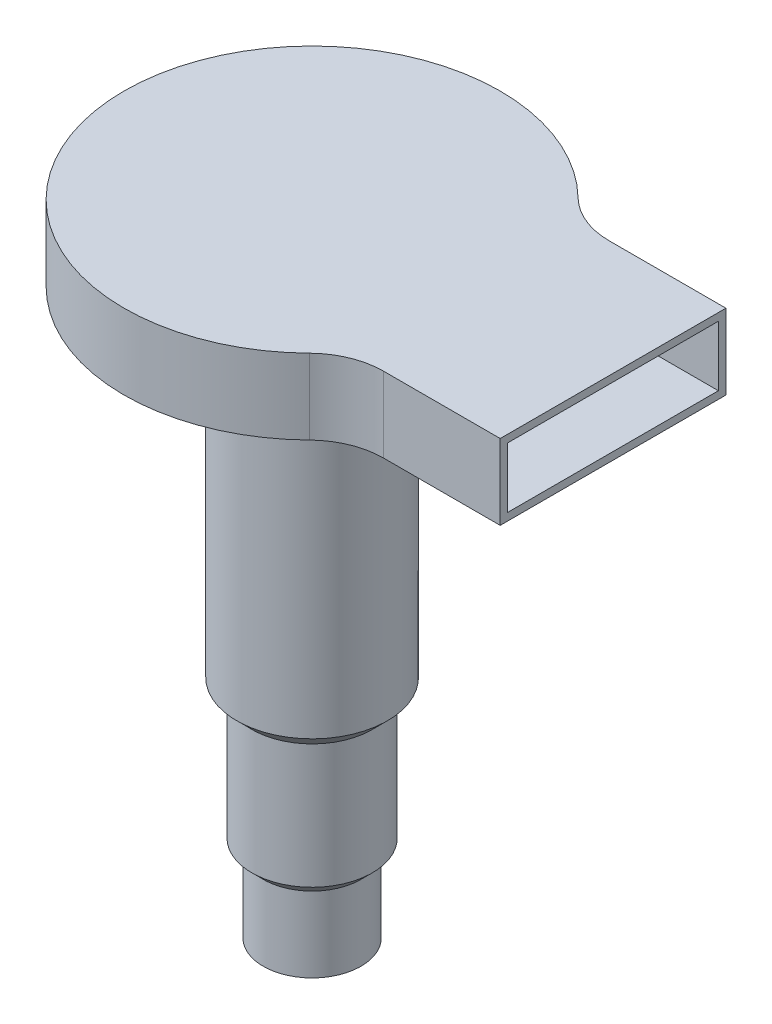
ISO-10303-21;
HEADER;
FILE_DESCRIPTION(('STEP AP214'),'2;1');
FILE_NAME('part.step','',(''),(''),'','','');
FILE_SCHEMA(('AUTOMOTIVE_DESIGN { 1 0 10303 214 1 1 1 1 }'));
ENDSEC;
DATA;
#1=APPLICATION_CONTEXT('core data for automotive mechanical design processes');
#2=APPLICATION_PROTOCOL_DEFINITION('international standard','automotive_design',2000,#1);
#3=PRODUCT_CONTEXT('',#1,'mechanical');
#4=PRODUCT('Part','Part','',(#3));
#5=PRODUCT_RELATED_PRODUCT_CATEGORY('part','',(#4));
#6=PRODUCT_DEFINITION_FORMATION('','',#4);
#7=PRODUCT_DEFINITION_CONTEXT('part definition',#1,'design');
#8=PRODUCT_DEFINITION('design','',#6,#7);
#9=PRODUCT_DEFINITION_SHAPE('','',#8);
#10=(LENGTH_UNIT() NAMED_UNIT(*) SI_UNIT(.MILLI.,.METRE.));
#11=(NAMED_UNIT(*) PLANE_ANGLE_UNIT() SI_UNIT($,.RADIAN.));
#12=(NAMED_UNIT(*) SI_UNIT($,.STERADIAN.) SOLID_ANGLE_UNIT());
#13=UNCERTAINTY_MEASURE_WITH_UNIT(LENGTH_MEASURE(1.E-05),#10,'distance_accuracy_value','');
#14=(GEOMETRIC_REPRESENTATION_CONTEXT(3) GLOBAL_UNCERTAINTY_ASSIGNED_CONTEXT((#13)) GLOBAL_UNIT_ASSIGNED_CONTEXT((#10,
#11,#12)) REPRESENTATION_CONTEXT('',''));
#15=CARTESIAN_POINT('',(0.,0.,0.));
#16=DIRECTION('',(0.,0.,1.));
#17=DIRECTION('',(1.,0.,0.));
#18=AXIS2_PLACEMENT_3D('',#15,#16,#17);
#19=CARTESIAN_POINT('',(40.,85.,-15.));
#20=DIRECTION('',(-1.,0.,0.));
#21=DIRECTION('',(0.,0.,1.));
#22=AXIS2_PLACEMENT_3D('',#19,#20,#21);
#23=PLANE('',#22);
#24=DIRECTION('',(0.,0.,-1.));
#25=VECTOR('',#24,1.);
#26=CARTESIAN_POINT('',(40.,75.,-15.));
#27=LINE('',#26,#25);
#28=CARTESIAN_POINT('',(40.,75.,15.));
#29=VERTEX_POINT('',#28);
#30=CARTESIAN_POINT('',(40.,75.,-15.));
#31=VERTEX_POINT('',#30);
#32=EDGE_CURVE('E144',#29,#31,#27,.T.);
#33=ORIENTED_EDGE('',*,*,#32,.T.);
#34=DIRECTION('',(0.,-1.,0.));
#35=VECTOR('',#34,1.);
#36=CARTESIAN_POINT('',(40.,85.,-15.));
#37=LINE('',#36,#35);
#38=CARTESIAN_POINT('',(40.,85.,-15.));
#39=VERTEX_POINT('',#38);
#40=EDGE_CURVE('E44',#39,#31,#37,.T.);
#41=ORIENTED_EDGE('',*,*,#40,.F.);
#42=DIRECTION('',(0.,0.,-1.));
#43=VECTOR('',#42,1.);
#44=CARTESIAN_POINT('',(40.,85.,-15.));
#45=LINE('',#44,#43);
#46=CARTESIAN_POINT('',(40.,85.,15.));
#47=VERTEX_POINT('',#46);
#48=EDGE_CURVE('E162',#47,#39,#45,.T.);
#49=ORIENTED_EDGE('',*,*,#48,.F.);
#50=DIRECTION('',(0.,-1.,0.));
#51=VECTOR('',#50,1.);
#52=CARTESIAN_POINT('',(40.,85.,15.));
#53=LINE('',#52,#51);
#54=EDGE_CURVE('E140',#47,#29,#53,.T.);
#55=ORIENTED_EDGE('',*,*,#54,.T.);
#56=EDGE_LOOP('',(#33,#41,#49,#55));
#57=FACE_BOUND('',#56,.T.);
#58=DIRECTION('',(0.,0.,-1.));
#59=VECTOR('',#58,1.);
#60=CARTESIAN_POINT('',(40.,76.,25.));
#61=LINE('',#60,#59);
#62=CARTESIAN_POINT('',(40.,76.,14.));
#63=VERTEX_POINT('',#62);
#64=CARTESIAN_POINT('',(40.,76.,-14.));
#65=VERTEX_POINT('',#64);
#66=EDGE_CURVE('E189',#63,#65,#61,.T.);
#67=ORIENTED_EDGE('',*,*,#66,.F.);
#68=DIRECTION('',(0.,-1.,0.));
#69=VECTOR('',#68,1.);
#70=CARTESIAN_POINT('',(40.,85.,14.));
#71=LINE('',#70,#69);
#72=CARTESIAN_POINT('',(40.,84.,14.));
#73=VERTEX_POINT('',#72);
#74=EDGE_CURVE('E195',#73,#63,#71,.T.);
#75=ORIENTED_EDGE('',*,*,#74,.F.);
#76=DIRECTION('',(0.,0.,-1.));
#77=VECTOR('',#76,1.);
#78=CARTESIAN_POINT('',(40.,84.,25.));
#79=LINE('',#78,#77);
#80=CARTESIAN_POINT('',(40.,84.,-14.));
#81=VERTEX_POINT('',#80);
#82=EDGE_CURVE('E57',#73,#81,#79,.T.);
#83=ORIENTED_EDGE('',*,*,#82,.T.);
#84=DIRECTION('',(0.,-1.,0.));
#85=VECTOR('',#84,1.);
#86=CARTESIAN_POINT('',(40.,85.,-14.));
#87=LINE('',#86,#85);
#88=EDGE_CURVE('E149',#81,#65,#87,.T.);
#89=ORIENTED_EDGE('',*,*,#88,.T.);
#90=EDGE_LOOP('',(#67,#75,#83,#89));
#91=FACE_BOUND('',#90,.T.);
#92=ADVANCED_FACE('F41',(#57,#91),#23,.F.);
#93=CARTESIAN_POINT('',(24.4948974278318,85.,-15.));
#94=DIRECTION('',(0.,0.,1.));
#95=DIRECTION('',(1.,0.,0.));
#96=AXIS2_PLACEMENT_3D('',#93,#94,#95);
#97=PLANE('',#96);
#98=DIRECTION('',(-1.,0.,0.));
#99=VECTOR('',#98,1.);
#100=CARTESIAN_POINT('',(24.4948974278318,75.,-15.));
#101=LINE('',#100,#99);
#102=CARTESIAN_POINT('',(24.4948974278318,75.,-15.));
#103=VERTEX_POINT('',#102);
#104=EDGE_CURVE('E148',#31,#103,#101,.T.);
#105=ORIENTED_EDGE('',*,*,#104,.T.);
#106=DIRECTION('',(0.,-1.,0.));
#107=VECTOR('',#106,1.);
#108=CARTESIAN_POINT('',(24.4948974278318,85.,-15.));
#109=LINE('',#108,#107);
#110=CARTESIAN_POINT('',(24.4948974278318,85.,-15.));
#111=VERTEX_POINT('',#110);
#112=EDGE_CURVE('E168',#111,#103,#109,.T.);
#113=ORIENTED_EDGE('',*,*,#112,.F.);
#114=DIRECTION('',(-1.,0.,0.));
#115=VECTOR('',#114,1.);
#116=CARTESIAN_POINT('',(24.4948974278318,85.,-15.));
#117=LINE('',#116,#115);
#118=EDGE_CURVE('E102',#39,#111,#117,.T.);
#119=ORIENTED_EDGE('',*,*,#118,.F.);
#120=ORIENTED_EDGE('',*,*,#40,.T.);
#121=EDGE_LOOP('',(#105,#113,#119,#120));
#122=FACE_BOUND('',#121,.T.);
#123=ADVANCED_FACE('F175',(#122),#97,.F.);
#124=CARTESIAN_POINT('',(24.4948974278318,85.,-25.));
#125=DIRECTION('',(0.,-1.,0.));
#126=DIRECTION('',(0.,0.,-1.));
#127=AXIS2_PLACEMENT_3D('',#124,#125,#126);
#128=CYLINDRICAL_SURFACE('',#127,10.);
#129=CARTESIAN_POINT('',(24.4948974278318,75.,-25.));
#130=DIRECTION('',(0.,-1.,0.));
#131=DIRECTION('',(0.,0.,-1.));
#132=AXIS2_PLACEMENT_3D('',#129,#130,#131);
#133=CIRCLE('',#132,10.);
#134=CARTESIAN_POINT('',(17.4963553055941,75.,-17.8571428571429));
#135=VERTEX_POINT('',#134);
#136=EDGE_CURVE('E152',#103,#135,#133,.T.);
#137=ORIENTED_EDGE('',*,*,#136,.T.);
#138=DIRECTION('',(0.,-1.,0.));
#139=VECTOR('',#138,1.);
#140=CARTESIAN_POINT('',(17.4963553055941,85.,-17.8571428571429));
#141=LINE('',#140,#139);
#142=CARTESIAN_POINT('',(17.4963553055941,85.,-17.8571428571429));
#143=VERTEX_POINT('',#142);
#144=EDGE_CURVE('E133',#143,#135,#141,.T.);
#145=ORIENTED_EDGE('',*,*,#144,.F.);
#146=CARTESIAN_POINT('',(24.4948974278318,85.,-25.));
#147=DIRECTION('',(0.,-1.,0.));
#148=DIRECTION('',(0.,0.,-1.));
#149=AXIS2_PLACEMENT_3D('',#146,#147,#148);
#150=CIRCLE('',#149,10.);
#151=EDGE_CURVE('E119',#111,#143,#150,.T.);
#152=ORIENTED_EDGE('',*,*,#151,.F.);
#153=ORIENTED_EDGE('',*,*,#112,.T.);
#154=EDGE_LOOP('',(#137,#145,#152,#153));
#155=FACE_BOUND('',#154,.T.);
#156=ADVANCED_FACE('F182',(#155),#128,.F.);
#157=CARTESIAN_POINT('',(0.,85.,0.));
#158=DIRECTION('',(0.,-1.,0.));
#159=DIRECTION('',(0.,0.,-1.));
#160=AXIS2_PLACEMENT_3D('',#157,#158,#159);
#161=CYLINDRICAL_SURFACE('',#160,25.);
#162=CARTESIAN_POINT('',(0.,75.,0.));
#163=DIRECTION('',(0.,1.,0.));
#164=DIRECTION('',(0.,0.,1.));
#165=AXIS2_PLACEMENT_3D('',#162,#163,#164);
#166=CIRCLE('',#165,25.);
#167=CARTESIAN_POINT('',(17.4963553055941,75.,17.8571428571429));
#168=VERTEX_POINT('',#167);
#169=EDGE_CURVE('E129',#135,#168,#166,.T.);
#170=ORIENTED_EDGE('',*,*,#169,.T.);
#171=DIRECTION('',(0.,-1.,0.));
#172=VECTOR('',#171,1.);
#173=CARTESIAN_POINT('',(17.4963553055941,85.,17.8571428571429));
#174=LINE('',#173,#172);
#175=CARTESIAN_POINT('',(17.4963553055941,85.,17.8571428571429));
#176=VERTEX_POINT('',#175);
#177=EDGE_CURVE('E126',#176,#168,#174,.T.);
#178=ORIENTED_EDGE('',*,*,#177,.F.);
#179=CARTESIAN_POINT('',(0.,85.,0.));
#180=DIRECTION('',(0.,1.,0.));
#181=DIRECTION('',(0.,0.,1.));
#182=AXIS2_PLACEMENT_3D('',#179,#180,#181);
#183=CIRCLE('',#182,25.);
#184=EDGE_CURVE('E112',#143,#176,#183,.T.);
#185=ORIENTED_EDGE('',*,*,#184,.F.);
#186=ORIENTED_EDGE('',*,*,#144,.T.);
#187=EDGE_LOOP('',(#170,#178,#185,#186));
#188=FACE_BOUND('',#187,.T.);
#189=ADVANCED_FACE('F127',(#188),#161,.T.);
#190=CARTESIAN_POINT('',(24.4948974278318,85.,25.));
#191=DIRECTION('',(0.,-1.,0.));
#192=DIRECTION('',(0.,0.,-1.));
#193=AXIS2_PLACEMENT_3D('',#190,#191,#192);
#194=CYLINDRICAL_SURFACE('',#193,10.);
#195=CARTESIAN_POINT('',(24.4948974278318,75.,25.));
#196=DIRECTION('',(0.,-1.,0.));
#197=DIRECTION('',(0.,0.,-1.));
#198=AXIS2_PLACEMENT_3D('',#195,#196,#197);
#199=CIRCLE('',#198,10.);
#200=CARTESIAN_POINT('',(24.4948974278318,75.,15.));
#201=VERTEX_POINT('',#200);
#202=EDGE_CURVE('E157',#168,#201,#199,.T.);
#203=ORIENTED_EDGE('',*,*,#202,.T.);
#204=DIRECTION('',(0.,-1.,0.));
#205=VECTOR('',#204,1.);
#206=CARTESIAN_POINT('',(24.4948974278318,85.,15.));
#207=LINE('',#206,#205);
#208=CARTESIAN_POINT('',(24.4948974278318,85.,15.));
#209=VERTEX_POINT('',#208);
#210=EDGE_CURVE('E134',#209,#201,#207,.T.);
#211=ORIENTED_EDGE('',*,*,#210,.F.);
#212=CARTESIAN_POINT('',(24.4948974278318,85.,25.));
#213=DIRECTION('',(0.,-1.,0.));
#214=DIRECTION('',(0.,0.,-1.));
#215=AXIS2_PLACEMENT_3D('',#212,#213,#214);
#216=CIRCLE('',#215,10.);
#217=EDGE_CURVE('E116',#176,#209,#216,.T.);
#218=ORIENTED_EDGE('',*,*,#217,.F.);
#219=ORIENTED_EDGE('',*,*,#177,.T.);
#220=EDGE_LOOP('',(#203,#211,#218,#219));
#221=FACE_BOUND('',#220,.T.);
#222=ADVANCED_FACE('F136',(#221),#194,.F.);
#223=CARTESIAN_POINT('',(24.4948974278318,85.,15.));
#224=DIRECTION('',(0.,0.,-1.));
#225=DIRECTION('',(-1.,0.,0.));
#226=AXIS2_PLACEMENT_3D('',#223,#224,#225);
#227=PLANE('',#226);
#228=DIRECTION('',(1.,0.,0.));
#229=VECTOR('',#228,1.);
#230=CARTESIAN_POINT('',(24.4948974278318,75.,15.));
#231=LINE('',#230,#229);
#232=EDGE_CURVE('E93',#201,#29,#231,.T.);
#233=ORIENTED_EDGE('',*,*,#232,.T.);
#234=ORIENTED_EDGE('',*,*,#54,.F.);
#235=DIRECTION('',(1.,0.,0.));
#236=VECTOR('',#235,1.);
#237=CARTESIAN_POINT('',(24.4948974278318,85.,15.));
#238=LINE('',#237,#236);
#239=EDGE_CURVE('E66',#209,#47,#238,.T.);
#240=ORIENTED_EDGE('',*,*,#239,.F.);
#241=ORIENTED_EDGE('',*,*,#210,.T.);
#242=EDGE_LOOP('',(#233,#234,#240,#241));
#243=FACE_BOUND('',#242,.T.);
#244=ADVANCED_FACE('F319',(#243),#227,.F.);
#245=CARTESIAN_POINT('',(24.4948974278318,85.,25.));
#246=DIRECTION('',(0.,-1.,0.));
#247=DIRECTION('',(0.,0.,-1.));
#248=AXIS2_PLACEMENT_3D('',#245,#246,#247);
#249=PLANE('',#248);
#250=ORIENTED_EDGE('',*,*,#48,.T.);
#251=ORIENTED_EDGE('',*,*,#118,.T.);
#252=ORIENTED_EDGE('',*,*,#151,.T.);
#253=ORIENTED_EDGE('',*,*,#184,.T.);
#254=ORIENTED_EDGE('',*,*,#217,.T.);
#255=ORIENTED_EDGE('',*,*,#239,.T.);
#256=EDGE_LOOP('',(#250,#251,#252,#253,#254,#255));
#257=FACE_BOUND('',#256,.T.);
#258=ADVANCED_FACE('F114',(#257),#249,.F.);
#259=CARTESIAN_POINT('',(24.4948974278318,75.,25.));
#260=DIRECTION('',(0.,-1.,0.));
#261=DIRECTION('',(0.,0.,-1.));
#262=AXIS2_PLACEMENT_3D('',#259,#260,#261);
#263=PLANE('',#262);
#264=CARTESIAN_POINT('',(0.,75.,0.));
#265=DIRECTION('',(0.,-1.,0.));
#266=DIRECTION('',(0.,0.,-1.));
#267=AXIS2_PLACEMENT_3D('',#264,#265,#266);
#268=CIRCLE('',#267,12.);
#269=CARTESIAN_POINT('',(0.,75.,-12.));
#270=VERTEX_POINT('',#269);
#271=EDGE_CURVE('E11',#270,#270,#268,.T.);
#272=ORIENTED_EDGE('',*,*,#271,.F.);
#273=EDGE_LOOP('',(#272));
#274=FACE_BOUND('',#273,.T.);
#275=ORIENTED_EDGE('',*,*,#32,.F.);
#276=ORIENTED_EDGE('',*,*,#232,.F.);
#277=ORIENTED_EDGE('',*,*,#202,.F.);
#278=ORIENTED_EDGE('',*,*,#169,.F.);
#279=ORIENTED_EDGE('',*,*,#136,.F.);
#280=ORIENTED_EDGE('',*,*,#104,.F.);
#281=EDGE_LOOP('',(#275,#276,#277,#278,#279,#280));
#282=FACE_BOUND('',#281,.T.);
#283=ADVANCED_FACE('F181',(#274,#282),#263,.T.);
#284=CARTESIAN_POINT('',(24.4948974278318,85.,-14.));
#285=DIRECTION('',(0.,0.,1.));
#286=DIRECTION('',(1.,0.,0.));
#287=AXIS2_PLACEMENT_3D('',#284,#285,#286);
#288=PLANE('',#287);
#289=DIRECTION('',(-1.,0.,0.));
#290=VECTOR('',#289,1.);
#291=CARTESIAN_POINT('',(24.4948974278318,76.,-14.));
#292=LINE('',#291,#290);
#293=CARTESIAN_POINT('',(24.4948974278318,76.,-14.));
#294=VERTEX_POINT('',#293);
#295=EDGE_CURVE('E193',#65,#294,#292,.T.);
#296=ORIENTED_EDGE('',*,*,#295,.F.);
#297=ORIENTED_EDGE('',*,*,#88,.F.);
#298=DIRECTION('',(-1.,0.,0.));
#299=VECTOR('',#298,1.);
#300=CARTESIAN_POINT('',(24.4948974278318,84.,-14.));
#301=LINE('',#300,#299);
#302=CARTESIAN_POINT('',(24.4948974278318,84.,-14.));
#303=VERTEX_POINT('',#302);
#304=EDGE_CURVE('E203',#81,#303,#301,.T.);
#305=ORIENTED_EDGE('',*,*,#304,.T.);
#306=DIRECTION('',(0.,-1.,0.));
#307=VECTOR('',#306,1.);
#308=CARTESIAN_POINT('',(24.4948974278318,85.,-14.));
#309=LINE('',#308,#307);
#310=EDGE_CURVE('E208',#303,#294,#309,.T.);
#311=ORIENTED_EDGE('',*,*,#310,.T.);
#312=EDGE_LOOP('',(#296,#297,#305,#311));
#313=FACE_BOUND('',#312,.T.);
#314=ADVANCED_FACE('F324',(#313),#288,.T.);
#315=CARTESIAN_POINT('',(24.4948974278318,85.,-25.));
#316=DIRECTION('',(0.,-1.,0.));
#317=DIRECTION('',(0.,0.,-1.));
#318=AXIS2_PLACEMENT_3D('',#315,#316,#317);
#319=CYLINDRICAL_SURFACE('',#318,11.);
#320=CARTESIAN_POINT('',(24.4948974278318,76.,-25.));
#321=DIRECTION('',(0.,-1.,0.));
#322=DIRECTION('',(0.,0.,-1.));
#323=AXIS2_PLACEMENT_3D('',#320,#321,#322);
#324=CIRCLE('',#323,11.);
#325=CARTESIAN_POINT('',(16.7965010933704,76.,-17.1428571428571));
#326=VERTEX_POINT('',#325);
#327=EDGE_CURVE('E239',#294,#326,#324,.T.);
#328=ORIENTED_EDGE('',*,*,#327,.F.);
#329=ORIENTED_EDGE('',*,*,#310,.F.);
#330=CARTESIAN_POINT('',(24.4948974278318,84.,-25.));
#331=DIRECTION('',(0.,-1.,0.));
#332=DIRECTION('',(0.,0.,-1.));
#333=AXIS2_PLACEMENT_3D('',#330,#331,#332);
#334=CIRCLE('',#333,11.);
#335=CARTESIAN_POINT('',(16.7965010933704,84.,-17.1428571428571));
#336=VERTEX_POINT('',#335);
#337=EDGE_CURVE('E231',#303,#336,#334,.T.);
#338=ORIENTED_EDGE('',*,*,#337,.T.);
#339=DIRECTION('',(0.,-1.,0.));
#340=VECTOR('',#339,1.);
#341=CARTESIAN_POINT('',(16.7965010933704,85.,-17.1428571428571));
#342=LINE('',#341,#340);
#343=EDGE_CURVE('E235',#336,#326,#342,.T.);
#344=ORIENTED_EDGE('',*,*,#343,.T.);
#345=EDGE_LOOP('',(#328,#329,#338,#344));
#346=FACE_BOUND('',#345,.T.);
#347=ADVANCED_FACE('F347',(#346),#319,.T.);
#348=CARTESIAN_POINT('',(0.,85.,0.));
#349=DIRECTION('',(0.,-1.,0.));
#350=DIRECTION('',(0.,0.,-1.));
#351=AXIS2_PLACEMENT_3D('',#348,#349,#350);
#352=CYLINDRICAL_SURFACE('',#351,24.);
#353=CARTESIAN_POINT('',(0.,76.,0.));
#354=DIRECTION('',(0.,-1.,0.));
#355=DIRECTION('',(0.,0.,-1.));
#356=AXIS2_PLACEMENT_3D('',#353,#354,#355);
#357=CIRCLE('',#356,24.);
#358=CARTESIAN_POINT('',(16.7965010933704,76.,17.1428571428571));
#359=VERTEX_POINT('',#358);
#360=EDGE_CURVE('E227',#326,#359,#357,.F.);
#361=ORIENTED_EDGE('',*,*,#360,.F.);
#362=ORIENTED_EDGE('',*,*,#343,.F.);
#363=CARTESIAN_POINT('',(0.,84.,0.));
#364=DIRECTION('',(0.,-1.,0.));
#365=DIRECTION('',(0.,0.,-1.));
#366=AXIS2_PLACEMENT_3D('',#363,#364,#365);
#367=CIRCLE('',#366,24.);
#368=CARTESIAN_POINT('',(16.7965010933704,84.,17.1428571428571));
#369=VERTEX_POINT('',#368);
#370=EDGE_CURVE('E219',#336,#369,#367,.F.);
#371=ORIENTED_EDGE('',*,*,#370,.T.);
#372=DIRECTION('',(0.,-1.,0.));
#373=VECTOR('',#372,1.);
#374=CARTESIAN_POINT('',(16.7965010933704,85.,17.1428571428571));
#375=LINE('',#374,#373);
#376=EDGE_CURVE('E223',#369,#359,#375,.T.);
#377=ORIENTED_EDGE('',*,*,#376,.T.);
#378=EDGE_LOOP('',(#361,#362,#371,#377));
#379=FACE_BOUND('',#378,.T.);
#380=ADVANCED_FACE('F343',(#379),#352,.F.);
#381=CARTESIAN_POINT('',(24.4948974278318,85.,25.));
#382=DIRECTION('',(0.,-1.,0.));
#383=DIRECTION('',(0.,0.,-1.));
#384=AXIS2_PLACEMENT_3D('',#381,#382,#383);
#385=CYLINDRICAL_SURFACE('',#384,11.);
#386=CARTESIAN_POINT('',(24.4948974278318,76.,25.));
#387=DIRECTION('',(0.,-1.,0.));
#388=DIRECTION('',(0.,0.,-1.));
#389=AXIS2_PLACEMENT_3D('',#386,#387,#388);
#390=CIRCLE('',#389,11.);
#391=CARTESIAN_POINT('',(24.4948974278318,76.,14.));
#392=VERTEX_POINT('',#391);
#393=EDGE_CURVE('E215',#359,#392,#390,.T.);
#394=ORIENTED_EDGE('',*,*,#393,.F.);
#395=ORIENTED_EDGE('',*,*,#376,.F.);
#396=CARTESIAN_POINT('',(24.4948974278318,84.,25.));
#397=DIRECTION('',(0.,-1.,0.));
#398=DIRECTION('',(0.,0.,-1.));
#399=AXIS2_PLACEMENT_3D('',#396,#397,#398);
#400=CIRCLE('',#399,11.);
#401=CARTESIAN_POINT('',(24.4948974278318,84.,14.));
#402=VERTEX_POINT('',#401);
#403=EDGE_CURVE('E211',#369,#402,#400,.T.);
#404=ORIENTED_EDGE('',*,*,#403,.T.);
#405=DIRECTION('',(0.,1.,0.));
#406=VECTOR('',#405,1.);
#407=CARTESIAN_POINT('',(24.4948974278318,85.,14.));
#408=LINE('',#407,#406);
#409=EDGE_CURVE('E199',#402,#392,#408,.F.);
#410=ORIENTED_EDGE('',*,*,#409,.T.);
#411=EDGE_LOOP('',(#394,#395,#404,#410));
#412=FACE_BOUND('',#411,.T.);
#413=ADVANCED_FACE('F339',(#412),#385,.T.);
#414=CARTESIAN_POINT('',(24.4948974278318,85.,14.));
#415=DIRECTION('',(0.,0.,-1.));
#416=DIRECTION('',(-1.,0.,0.));
#417=AXIS2_PLACEMENT_3D('',#414,#415,#416);
#418=PLANE('',#417);
#419=DIRECTION('',(1.,0.,0.));
#420=VECTOR('',#419,1.);
#421=CARTESIAN_POINT('',(24.4948974278318,76.,14.));
#422=LINE('',#421,#420);
#423=EDGE_CURVE('E204',#392,#63,#422,.T.);
#424=ORIENTED_EDGE('',*,*,#423,.F.);
#425=ORIENTED_EDGE('',*,*,#409,.F.);
#426=DIRECTION('',(1.,0.,0.));
#427=VECTOR('',#426,1.);
#428=CARTESIAN_POINT('',(24.4948974278318,84.,14.));
#429=LINE('',#428,#427);
#430=EDGE_CURVE('E200',#402,#73,#429,.T.);
#431=ORIENTED_EDGE('',*,*,#430,.T.);
#432=ORIENTED_EDGE('',*,*,#74,.T.);
#433=EDGE_LOOP('',(#424,#425,#431,#432));
#434=FACE_BOUND('',#433,.T.);
#435=ADVANCED_FACE('F336',(#434),#418,.T.);
#436=CARTESIAN_POINT('',(24.4948974278318,84.,25.));
#437=DIRECTION('',(0.,-1.,0.));
#438=DIRECTION('',(0.,0.,-1.));
#439=AXIS2_PLACEMENT_3D('',#436,#437,#438);
#440=PLANE('',#439);
#441=ORIENTED_EDGE('',*,*,#82,.F.);
#442=ORIENTED_EDGE('',*,*,#430,.F.);
#443=ORIENTED_EDGE('',*,*,#403,.F.);
#444=ORIENTED_EDGE('',*,*,#370,.F.);
#445=ORIENTED_EDGE('',*,*,#337,.F.);
#446=ORIENTED_EDGE('',*,*,#304,.F.);
#447=EDGE_LOOP('',(#441,#442,#443,#444,#445,#446));
#448=FACE_BOUND('',#447,.T.);
#449=ADVANCED_FACE('F332',(#448),#440,.T.);
#450=CARTESIAN_POINT('',(24.4948974278318,76.,25.));
#451=DIRECTION('',(0.,-1.,0.));
#452=DIRECTION('',(0.,0.,-1.));
#453=AXIS2_PLACEMENT_3D('',#450,#451,#452);
#454=PLANE('',#453);
#455=ORIENTED_EDGE('',*,*,#66,.T.);
#456=ORIENTED_EDGE('',*,*,#295,.T.);
#457=ORIENTED_EDGE('',*,*,#327,.T.);
#458=ORIENTED_EDGE('',*,*,#360,.T.);
#459=ORIENTED_EDGE('',*,*,#393,.T.);
#460=ORIENTED_EDGE('',*,*,#423,.T.);
#461=EDGE_LOOP('',(#455,#456,#457,#458,#459,#460));
#462=FACE_BOUND('',#461,.T.);
#463=ADVANCED_FACE('F328',(#462),#454,.F.);
#464=CARTESIAN_POINT('',(0.,35.,-5.));
#465=DIRECTION('',(0.,-1.,0.));
#466=DIRECTION('',(0.,0.,-1.));
#467=AXIS2_PLACEMENT_3D('',#464,#465,#466);
#468=PLANE('',#467);
#469=CARTESIAN_POINT('',(0.,35.,0.));
#470=DIRECTION('',(0.,-1.,0.));
#471=DIRECTION('',(0.,0.,-1.));
#472=AXIS2_PLACEMENT_3D('',#469,#470,#471);
#473=CIRCLE('',#472,5.);
#474=CARTESIAN_POINT('',(0.,35.,-5.));
#475=VERTEX_POINT('',#474);
#476=EDGE_CURVE('E194',#475,#475,#473,.T.);
#477=ORIENTED_EDGE('',*,*,#476,.T.);
#478=EDGE_LOOP('',(#477));
#479=FACE_BOUND('',#478,.T.);
#480=ADVANCED_FACE('F331',(#479),#468,.T.);
#481=CARTESIAN_POINT('',(0.,0.,0.));
#482=DIRECTION('',(0.,-1.,0.));
#483=DIRECTION('',(0.,0.,-1.));
#484=AXIS2_PLACEMENT_3D('',#481,#482,#483);
#485=CYLINDRICAL_SURFACE('',#484,5.);
#486=CARTESIAN_POINT('',(0.,0.,0.));
#487=DIRECTION('',(0.,-1.,0.));
#488=DIRECTION('',(0.,0.,-1.));
#489=AXIS2_PLACEMENT_3D('',#486,#487,#488);
#490=CIRCLE('',#489,5.);
#491=CARTESIAN_POINT('',(0.,0.,-5.));
#492=VERTEX_POINT('',#491);
#493=EDGE_CURVE('E261',#492,#492,#490,.T.);
#494=ORIENTED_EDGE('',*,*,#493,.T.);
#495=EDGE_LOOP('',(#494));
#496=FACE_BOUND('',#495,.T.);
#497=ORIENTED_EDGE('',*,*,#476,.F.);
#498=EDGE_LOOP('',(#497));
#499=FACE_BOUND('',#498,.T.);
#500=ADVANCED_FACE('F357',(#496,#499),#485,.F.);
#501=CARTESIAN_POINT('',(0.,0.,-5.));
#502=DIRECTION('',(0.,-1.,0.));
#503=DIRECTION('',(0.,0.,-1.));
#504=AXIS2_PLACEMENT_3D('',#501,#502,#503);
#505=PLANE('',#504);
#506=CARTESIAN_POINT('',(0.,0.,0.));
#507=DIRECTION('',(0.,-1.,0.));
#508=DIRECTION('',(0.,0.,-1.));
#509=AXIS2_PLACEMENT_3D('',#506,#507,#508);
#510=CIRCLE('',#509,6.5);
#511=CARTESIAN_POINT('',(0.,0.,-6.5));
#512=VERTEX_POINT('',#511);
#513=EDGE_CURVE('E265',#512,#512,#510,.T.);
#514=ORIENTED_EDGE('',*,*,#513,.T.);
#515=EDGE_LOOP('',(#514));
#516=FACE_BOUND('',#515,.T.);
#517=ORIENTED_EDGE('',*,*,#493,.F.);
#518=EDGE_LOOP('',(#517));
#519=FACE_BOUND('',#518,.T.);
#520=ADVANCED_FACE('F361',(#516,#519),#505,.T.);
#521=CARTESIAN_POINT('',(0.,0.,0.));
#522=DIRECTION('',(0.,-1.,0.));
#523=DIRECTION('',(0.,0.,-1.));
#524=AXIS2_PLACEMENT_3D('',#521,#522,#523);
#525=CYLINDRICAL_SURFACE('',#524,6.5);
#526=CARTESIAN_POINT('',(0.,10.,0.));
#527=DIRECTION('',(0.,-1.,0.));
#528=DIRECTION('',(0.,0.,-1.));
#529=AXIS2_PLACEMENT_3D('',#526,#527,#528);
#530=CIRCLE('',#529,6.5);
#531=CARTESIAN_POINT('',(0.,10.,-6.5));
#532=VERTEX_POINT('',#531);
#533=EDGE_CURVE('E269',#532,#532,#530,.T.);
#534=ORIENTED_EDGE('',*,*,#533,.T.);
#535=EDGE_LOOP('',(#534));
#536=FACE_BOUND('',#535,.T.);
#537=ORIENTED_EDGE('',*,*,#513,.F.);
#538=EDGE_LOOP('',(#537));
#539=FACE_BOUND('',#538,.T.);
#540=ADVANCED_FACE('F365',(#536,#539),#525,.T.);
#541=CARTESIAN_POINT('',(0.,10.,0.));
#542=DIRECTION('',(0.,1.,0.));
#543=DIRECTION('',(0.,0.,1.));
#544=AXIS2_PLACEMENT_3D('',#541,#542,#543);
#545=CONICAL_SURFACE('',#544,6.5,0.78539816339745);
#546=CARTESIAN_POINT('',(0.,11.5,0.));
#547=DIRECTION('',(0.,-1.,0.));
#548=DIRECTION('',(0.,0.,-1.));
#549=AXIS2_PLACEMENT_3D('',#546,#547,#548);
#550=CIRCLE('',#549,8.);
#551=CARTESIAN_POINT('',(0.,11.5,-8.));
#552=VERTEX_POINT('',#551);
#553=EDGE_CURVE('E273',#552,#552,#550,.T.);
#554=ORIENTED_EDGE('',*,*,#553,.T.);
#555=EDGE_LOOP('',(#554));
#556=FACE_BOUND('',#555,.T.);
#557=ORIENTED_EDGE('',*,*,#533,.F.);
#558=EDGE_LOOP('',(#557));
#559=FACE_BOUND('',#558,.T.);
#560=ADVANCED_FACE('F369',(#556,#559),#545,.T.);
#561=CARTESIAN_POINT('',(0.,0.,0.));
#562=DIRECTION('',(0.,-1.,0.));
#563=DIRECTION('',(0.,0.,-1.));
#564=AXIS2_PLACEMENT_3D('',#561,#562,#563);
#565=CYLINDRICAL_SURFACE('',#564,8.);
#566=CARTESIAN_POINT('',(0.,28.,0.));
#567=DIRECTION('',(0.,-1.,0.));
#568=DIRECTION('',(0.,0.,-1.));
#569=AXIS2_PLACEMENT_3D('',#566,#567,#568);
#570=CIRCLE('',#569,8.);
#571=CARTESIAN_POINT('',(0.,28.,-8.));
#572=VERTEX_POINT('',#571);
#573=EDGE_CURVE('E277',#572,#572,#570,.T.);
#574=ORIENTED_EDGE('',*,*,#573,.T.);
#575=EDGE_LOOP('',(#574));
#576=FACE_BOUND('',#575,.T.);
#577=ORIENTED_EDGE('',*,*,#553,.F.);
#578=EDGE_LOOP('',(#577));
#579=FACE_BOUND('',#578,.T.);
#580=ADVANCED_FACE('F373',(#576,#579),#565,.T.);
#581=CARTESIAN_POINT('',(0.,28.,0.));
#582=DIRECTION('',(0.,1.,0.));
#583=DIRECTION('',(0.,0.,1.));
#584=AXIS2_PLACEMENT_3D('',#581,#582,#583);
#585=CONICAL_SURFACE('',#584,8.,0.78539816339745);
#586=CARTESIAN_POINT('',(0.,30.,0.));
#587=DIRECTION('',(0.,-1.,0.));
#588=DIRECTION('',(0.,0.,-1.));
#589=AXIS2_PLACEMENT_3D('',#586,#587,#588);
#590=CIRCLE('',#589,10.);
#591=CARTESIAN_POINT('',(0.,30.,-10.));
#592=VERTEX_POINT('',#591);
#593=EDGE_CURVE('E281',#592,#592,#590,.T.);
#594=ORIENTED_EDGE('',*,*,#593,.T.);
#595=EDGE_LOOP('',(#594));
#596=FACE_BOUND('',#595,.T.);
#597=ORIENTED_EDGE('',*,*,#573,.F.);
#598=EDGE_LOOP('',(#597));
#599=FACE_BOUND('',#598,.T.);
#600=ADVANCED_FACE('F377',(#596,#599),#585,.T.);
#601=CARTESIAN_POINT('',(0.,0.,0.));
#602=DIRECTION('',(0.,-1.,0.));
#603=DIRECTION('',(0.,0.,-1.));
#604=AXIS2_PLACEMENT_3D('',#601,#602,#603);
#605=CYLINDRICAL_SURFACE('',#604,10.);
#606=CARTESIAN_POINT('',(0.,70.,0.));
#607=DIRECTION('',(0.,-1.,0.));
#608=DIRECTION('',(0.,0.,-1.));
#609=AXIS2_PLACEMENT_3D('',#606,#607,#608);
#610=CIRCLE('',#609,10.);
#611=CARTESIAN_POINT('',(0.,70.,-10.));
#612=VERTEX_POINT('',#611);
#613=EDGE_CURVE('E285',#612,#612,#610,.T.);
#614=ORIENTED_EDGE('',*,*,#613,.T.);
#615=EDGE_LOOP('',(#614));
#616=FACE_BOUND('',#615,.T.);
#617=ORIENTED_EDGE('',*,*,#593,.F.);
#618=EDGE_LOOP('',(#617));
#619=FACE_BOUND('',#618,.T.);
#620=ADVANCED_FACE('F303',(#616,#619),#605,.T.);
#621=CARTESIAN_POINT('',(0.,70.,-10.));
#622=DIRECTION('',(0.,-1.,0.));
#623=DIRECTION('',(0.,0.,-1.));
#624=AXIS2_PLACEMENT_3D('',#621,#622,#623);
#625=PLANE('',#624);
#626=CARTESIAN_POINT('',(0.,70.,0.));
#627=DIRECTION('',(0.,-1.,0.));
#628=DIRECTION('',(0.,0.,-1.));
#629=AXIS2_PLACEMENT_3D('',#626,#627,#628);
#630=CIRCLE('',#629,12.);
#631=CARTESIAN_POINT('',(0.,70.,-12.));
#632=VERTEX_POINT('',#631);
#633=EDGE_CURVE('E289',#632,#632,#630,.T.);
#634=ORIENTED_EDGE('',*,*,#633,.T.);
#635=EDGE_LOOP('',(#634));
#636=FACE_BOUND('',#635,.T.);
#637=ORIENTED_EDGE('',*,*,#613,.F.);
#638=EDGE_LOOP('',(#637));
#639=FACE_BOUND('',#638,.T.);
#640=ADVANCED_FACE('F294',(#636,#639),#625,.T.);
#641=CARTESIAN_POINT('',(0.,0.,0.));
#642=DIRECTION('',(0.,-1.,0.));
#643=DIRECTION('',(0.,0.,-1.));
#644=AXIS2_PLACEMENT_3D('',#641,#642,#643);
#645=CYLINDRICAL_SURFACE('',#644,12.);
#646=ORIENTED_EDGE('',*,*,#271,.T.);
#647=EDGE_LOOP('',(#646));
#648=FACE_BOUND('',#647,.T.);
#649=ORIENTED_EDGE('',*,*,#633,.F.);
#650=EDGE_LOOP('',(#649));
#651=FACE_BOUND('',#650,.T.);
#652=ADVANCED_FACE('F297',(#648,#651),#645,.T.);
#653=CLOSED_SHELL('',(#92,#123,#156,#189,#222,#244,#258,#283,#314,#347,#380,#413,#435,#449,#463,
#480,#500,#520,#540,#560,#580,#600,#620,#640,#652));
#654=MANIFOLD_SOLID_BREP('B2',#653);
#655=ADVANCED_BREP_SHAPE_REPRESENTATION('',(#18,#654),#14);
#656=SHAPE_DEFINITION_REPRESENTATION(#9,#655);
ENDSEC;
END-ISO-10303-21;
